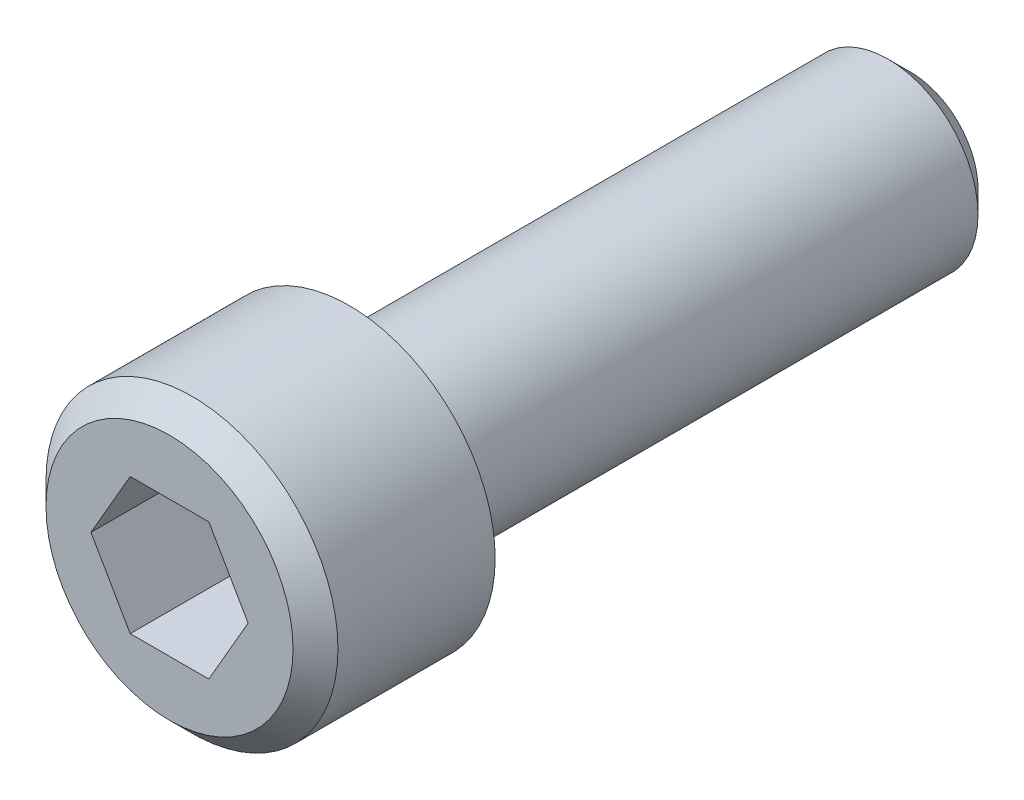
ISO-10303-21;
HEADER;
FILE_DESCRIPTION(('STEP AP214'),'2;1');
FILE_NAME('part.step','',(''),(''),'','','');
FILE_SCHEMA(('AUTOMOTIVE_DESIGN { 1 0 10303 214 1 1 1 1 }'));
ENDSEC;
DATA;
#1=APPLICATION_CONTEXT('core data for automotive mechanical design processes');
#2=APPLICATION_PROTOCOL_DEFINITION('international standard','automotive_design',2000,#1);
#3=PRODUCT_CONTEXT('',#1,'mechanical');
#4=PRODUCT('Part','Part','',(#3));
#5=PRODUCT_RELATED_PRODUCT_CATEGORY('part','',(#4));
#6=PRODUCT_DEFINITION_FORMATION('','',#4);
#7=PRODUCT_DEFINITION_CONTEXT('part definition',#1,'design');
#8=PRODUCT_DEFINITION('design','',#6,#7);
#9=PRODUCT_DEFINITION_SHAPE('','',#8);
#10=(LENGTH_UNIT() NAMED_UNIT(*) SI_UNIT(.MILLI.,.METRE.));
#11=(NAMED_UNIT(*) PLANE_ANGLE_UNIT() SI_UNIT($,.RADIAN.));
#12=(NAMED_UNIT(*) SI_UNIT($,.STERADIAN.) SOLID_ANGLE_UNIT());
#13=UNCERTAINTY_MEASURE_WITH_UNIT(LENGTH_MEASURE(1.E-05),#10,'distance_accuracy_value','');
#14=(GEOMETRIC_REPRESENTATION_CONTEXT(3) GLOBAL_UNCERTAINTY_ASSIGNED_CONTEXT((#13)) GLOBAL_UNIT_ASSIGNED_CONTEXT((#10,
#11,#12)) REPRESENTATION_CONTEXT('',''));
#15=CARTESIAN_POINT('',(0.,0.,0.));
#16=DIRECTION('',(0.,0.,1.));
#17=DIRECTION('',(1.,0.,0.));
#18=AXIS2_PLACEMENT_3D('',#15,#16,#17);
#19=CARTESIAN_POINT('',(0.,0.,0.));
#20=DIRECTION('',(0.,0.,1.));
#21=DIRECTION('',(1.,0.,0.));
#22=AXIS2_PLACEMENT_3D('',#19,#20,#21);
#23=PLANE('',#22);
#24=CARTESIAN_POINT('',(0.,0.,0.));
#25=DIRECTION('',(0.,0.,1.));
#26=DIRECTION('',(1.,0.,0.));
#27=AXIS2_PLACEMENT_3D('',#24,#25,#26);
#28=CIRCLE('',#27,6.5);
#29=CARTESIAN_POINT('',(6.5,0.,0.));
#30=VERTEX_POINT('',#29);
#31=EDGE_CURVE('E135',#30,#30,#28,.T.);
#32=ORIENTED_EDGE('',*,*,#31,.F.);
#33=EDGE_LOOP('',(#32));
#34=FACE_BOUND('',#33,.T.);
#35=CARTESIAN_POINT('',(0.,0.,0.));
#36=DIRECTION('',(0.,0.,1.));
#37=DIRECTION('',(1.,0.,0.));
#38=AXIS2_PLACEMENT_3D('',#35,#36,#37);
#39=CIRCLE('',#38,4.);
#40=CARTESIAN_POINT('',(4.,0.,0.));
#41=VERTEX_POINT('',#40);
#42=EDGE_CURVE('E143',#41,#41,#39,.F.);
#43=ORIENTED_EDGE('',*,*,#42,.F.);
#44=EDGE_LOOP('',(#43));
#45=FACE_BOUND('',#44,.T.);
#46=ADVANCED_FACE('F33',(#34,#45),#23,.F.);
#47=CARTESIAN_POINT('',(0.,0.,8.));
#48=DIRECTION('',(0.,0.,-1.));
#49=DIRECTION('',(-1.,0.,0.));
#50=AXIS2_PLACEMENT_3D('',#47,#48,#49);
#51=CYLINDRICAL_SURFACE('',#50,6.5);
#52=CARTESIAN_POINT('',(0.,0.,7.00000000000001));
#53=DIRECTION('',(0.,0.,1.));
#54=DIRECTION('',(1.,0.,0.));
#55=AXIS2_PLACEMENT_3D('',#52,#53,#54);
#56=CIRCLE('',#55,6.5);
#57=CARTESIAN_POINT('',(6.5,0.,7.00000000000001));
#58=VERTEX_POINT('',#57);
#59=EDGE_CURVE('E149',#58,#58,#56,.F.);
#60=ORIENTED_EDGE('',*,*,#59,.T.);
#61=EDGE_LOOP('',(#60));
#62=FACE_BOUND('',#61,.T.);
#63=ORIENTED_EDGE('',*,*,#31,.T.);
#64=EDGE_LOOP('',(#63));
#65=FACE_BOUND('',#64,.T.);
#66=ADVANCED_FACE('F169',(#62,#65),#51,.T.);
#67=CARTESIAN_POINT('',(0.,0.,8.));
#68=DIRECTION('',(0.,0.,1.));
#69=DIRECTION('',(1.,0.,0.));
#70=AXIS2_PLACEMENT_3D('',#67,#68,#69);
#71=PLANE('',#70);
#72=DIRECTION('',(0.5,0.866025403784439,0.));
#73=VECTOR('',#72,1.);
#74=CARTESIAN_POINT('',(1.75,-3.03108891324554,8.));
#75=LINE('',#74,#73);
#76=CARTESIAN_POINT('',(1.75,-3.03108891324554,8.));
#77=VERTEX_POINT('',#76);
#78=CARTESIAN_POINT('',(3.5,0.,8.));
#79=VERTEX_POINT('',#78);
#80=EDGE_CURVE('E48',#77,#79,#75,.T.);
#81=ORIENTED_EDGE('',*,*,#80,.F.);
#82=DIRECTION('',(1.,0.,0.));
#83=VECTOR('',#82,1.);
#84=CARTESIAN_POINT('',(-1.75,-3.03108891324554,8.));
#85=LINE('',#84,#83);
#86=CARTESIAN_POINT('',(-1.75,-3.03108891324554,8.));
#87=VERTEX_POINT('',#86);
#88=EDGE_CURVE('E131',#87,#77,#85,.T.);
#89=ORIENTED_EDGE('',*,*,#88,.F.);
#90=DIRECTION('',(0.5,-0.866025403784439,0.));
#91=VECTOR('',#90,1.);
#92=CARTESIAN_POINT('',(-3.5,0.,8.));
#93=LINE('',#92,#91);
#94=CARTESIAN_POINT('',(-3.5,0.,8.));
#95=VERTEX_POINT('',#94);
#96=EDGE_CURVE('E129',#95,#87,#93,.T.);
#97=ORIENTED_EDGE('',*,*,#96,.F.);
#98=DIRECTION('',(-0.5,-0.866025403784439,0.));
#99=VECTOR('',#98,1.);
#100=CARTESIAN_POINT('',(-1.75,3.03108891324554,8.));
#101=LINE('',#100,#99);
#102=CARTESIAN_POINT('',(-1.75,3.03108891324554,8.));
#103=VERTEX_POINT('',#102);
#104=EDGE_CURVE('E96',#103,#95,#101,.T.);
#105=ORIENTED_EDGE('',*,*,#104,.F.);
#106=DIRECTION('',(-1.,0.,0.));
#107=VECTOR('',#106,1.);
#108=CARTESIAN_POINT('',(1.75,3.03108891324554,8.));
#109=LINE('',#108,#107);
#110=CARTESIAN_POINT('',(1.75,3.03108891324554,8.));
#111=VERTEX_POINT('',#110);
#112=EDGE_CURVE('E125',#111,#103,#109,.T.);
#113=ORIENTED_EDGE('',*,*,#112,.F.);
#114=DIRECTION('',(-0.5,0.866025403784438,0.));
#115=VECTOR('',#114,1.);
#116=CARTESIAN_POINT('',(3.5,0.,8.));
#117=LINE('',#116,#115);
#118=EDGE_CURVE('E122',#79,#111,#117,.T.);
#119=ORIENTED_EDGE('',*,*,#118,.F.);
#120=EDGE_LOOP('',(#81,#89,#97,#105,#113,#119));
#121=FACE_BOUND('',#120,.T.);
#122=CARTESIAN_POINT('',(0.,0.,8.));
#123=DIRECTION('',(0.,0.,1.));
#124=DIRECTION('',(1.,0.,0.));
#125=AXIS2_PLACEMENT_3D('',#122,#123,#124);
#126=CIRCLE('',#125,5.50000000000001);
#127=CARTESIAN_POINT('',(5.50000000000001,0.,8.));
#128=VERTEX_POINT('',#127);
#129=EDGE_CURVE('E146',#128,#128,#126,.T.);
#130=ORIENTED_EDGE('',*,*,#129,.T.);
#131=EDGE_LOOP('',(#130));
#132=FACE_BOUND('',#131,.T.);
#133=ADVANCED_FACE('F175',(#121,#132),#71,.T.);
#134=CARTESIAN_POINT('',(0.,0.,-25.));
#135=DIRECTION('',(0.,0.,1.));
#136=DIRECTION('',(1.,0.,0.));
#137=AXIS2_PLACEMENT_3D('',#134,#135,#136);
#138=CYLINDRICAL_SURFACE('',#137,4.);
#139=CARTESIAN_POINT('',(0.,0.,-24.));
#140=DIRECTION('',(0.,0.,-1.));
#141=DIRECTION('',(-1.,0.,0.));
#142=AXIS2_PLACEMENT_3D('',#139,#140,#141);
#143=CIRCLE('',#142,4.);
#144=CARTESIAN_POINT('',(-4.,0.,-24.));
#145=VERTEX_POINT('',#144);
#146=EDGE_CURVE('E11',#145,#145,#143,.F.);
#147=ORIENTED_EDGE('',*,*,#146,.T.);
#148=EDGE_LOOP('',(#147));
#149=FACE_BOUND('',#148,.T.);
#150=ORIENTED_EDGE('',*,*,#42,.T.);
#151=EDGE_LOOP('',(#150));
#152=FACE_BOUND('',#151,.T.);
#153=ADVANCED_FACE('F183',(#149,#152),#138,.T.);
#154=CARTESIAN_POINT('',(0.,0.,-25.));
#155=DIRECTION('',(0.,0.,-1.));
#156=DIRECTION('',(-1.,0.,0.));
#157=AXIS2_PLACEMENT_3D('',#154,#155,#156);
#158=PLANE('',#157);
#159=CARTESIAN_POINT('',(0.,0.,-25.));
#160=DIRECTION('',(0.,0.,-1.));
#161=DIRECTION('',(-1.,0.,0.));
#162=AXIS2_PLACEMENT_3D('',#159,#160,#161);
#163=CIRCLE('',#162,3.);
#164=CARTESIAN_POINT('',(-3.,0.,-25.));
#165=VERTEX_POINT('',#164);
#166=EDGE_CURVE('E41',#165,#165,#163,.T.);
#167=ORIENTED_EDGE('',*,*,#166,.T.);
#168=EDGE_LOOP('',(#167));
#169=FACE_BOUND('',#168,.T.);
#170=ADVANCED_FACE('F154',(#169),#158,.T.);
#171=CARTESIAN_POINT('',(0.,0.,8.));
#172=DIRECTION('',(0.,0.,-1.));
#173=DIRECTION('',(-1.,0.,0.));
#174=AXIS2_PLACEMENT_3D('',#171,#172,#173);
#175=CONICAL_SURFACE('',#174,5.50000000000001,0.785398163397448);
#176=ORIENTED_EDGE('',*,*,#59,.F.);
#177=EDGE_LOOP('',(#176));
#178=FACE_BOUND('',#177,.T.);
#179=ORIENTED_EDGE('',*,*,#129,.F.);
#180=EDGE_LOOP('',(#179));
#181=FACE_BOUND('',#180,.T.);
#182=ADVANCED_FACE('F158',(#178,#181),#175,.T.);
#183=CARTESIAN_POINT('',(0.,0.,-25.));
#184=DIRECTION('',(0.,0.,1.));
#185=DIRECTION('',(1.,0.,0.));
#186=AXIS2_PLACEMENT_3D('',#183,#184,#185);
#187=CONICAL_SURFACE('',#186,3.,0.785398163397448);
#188=ORIENTED_EDGE('',*,*,#146,.F.);
#189=EDGE_LOOP('',(#188));
#190=FACE_BOUND('',#189,.T.);
#191=ORIENTED_EDGE('',*,*,#166,.F.);
#192=EDGE_LOOP('',(#191));
#193=FACE_BOUND('',#192,.T.);
#194=ADVANCED_FACE('F35',(#190,#193),#187,.T.);
#195=CARTESIAN_POINT('',(1.75,-3.03108891324554,2.));
#196=DIRECTION('',(0.866025403784439,-0.5,0.));
#197=DIRECTION('',(0.5,0.866025403784439,0.));
#198=AXIS2_PLACEMENT_3D('',#195,#196,#197);
#199=PLANE('',#198);
#200=ORIENTED_EDGE('',*,*,#80,.T.);
#201=DIRECTION('',(0.,0.,1.));
#202=VECTOR('',#201,1.);
#203=CARTESIAN_POINT('',(3.5,0.,2.));
#204=LINE('',#203,#202);
#205=CARTESIAN_POINT('',(3.5,0.,2.));
#206=VERTEX_POINT('',#205);
#207=EDGE_CURVE('E78',#206,#79,#204,.T.);
#208=ORIENTED_EDGE('',*,*,#207,.F.);
#209=DIRECTION('',(0.5,0.866025403784439,0.));
#210=VECTOR('',#209,1.);
#211=CARTESIAN_POINT('',(1.75,-3.03108891324554,2.));
#212=LINE('',#211,#210);
#213=CARTESIAN_POINT('',(1.75,-3.03108891324554,2.));
#214=VERTEX_POINT('',#213);
#215=EDGE_CURVE('E133',#214,#206,#212,.T.);
#216=ORIENTED_EDGE('',*,*,#215,.F.);
#217=DIRECTION('',(0.,0.,1.));
#218=VECTOR('',#217,1.);
#219=CARTESIAN_POINT('',(1.75,-3.03108891324554,2.));
#220=LINE('',#219,#218);
#221=EDGE_CURVE('E56',#214,#77,#220,.T.);
#222=ORIENTED_EDGE('',*,*,#221,.T.);
#223=EDGE_LOOP('',(#200,#208,#216,#222));
#224=FACE_BOUND('',#223,.T.);
#225=ADVANCED_FACE('F157',(#224),#199,.F.);
#226=CARTESIAN_POINT('',(-1.75,-3.03108891324554,2.));
#227=DIRECTION('',(0.,-1.,0.));
#228=DIRECTION('',(0.,0.,-1.));
#229=AXIS2_PLACEMENT_3D('',#226,#227,#228);
#230=PLANE('',#229);
#231=ORIENTED_EDGE('',*,*,#88,.T.);
#232=ORIENTED_EDGE('',*,*,#221,.F.);
#233=DIRECTION('',(1.,0.,0.));
#234=VECTOR('',#233,1.);
#235=CARTESIAN_POINT('',(-1.75,-3.03108891324554,2.));
#236=LINE('',#235,#234);
#237=CARTESIAN_POINT('',(-1.75,-3.03108891324554,2.));
#238=VERTEX_POINT('',#237);
#239=EDGE_CURVE('E108',#238,#214,#236,.T.);
#240=ORIENTED_EDGE('',*,*,#239,.F.);
#241=DIRECTION('',(0.,0.,1.));
#242=VECTOR('',#241,1.);
#243=CARTESIAN_POINT('',(-1.75,-3.03108891324554,2.));
#244=LINE('',#243,#242);
#245=EDGE_CURVE('E100',#238,#87,#244,.T.);
#246=ORIENTED_EDGE('',*,*,#245,.T.);
#247=EDGE_LOOP('',(#231,#232,#240,#246));
#248=FACE_BOUND('',#247,.T.);
#249=ADVANCED_FACE('F164',(#248),#230,.F.);
#250=CARTESIAN_POINT('',(-3.5,0.,2.));
#251=DIRECTION('',(-0.866025403784439,-0.5,0.));
#252=DIRECTION('',(0.5,-0.866025403784439,0.));
#253=AXIS2_PLACEMENT_3D('',#250,#251,#252);
#254=PLANE('',#253);
#255=ORIENTED_EDGE('',*,*,#96,.T.);
#256=ORIENTED_EDGE('',*,*,#245,.F.);
#257=DIRECTION('',(0.5,-0.866025403784439,0.));
#258=VECTOR('',#257,1.);
#259=CARTESIAN_POINT('',(-3.5,0.,2.));
#260=LINE('',#259,#258);
#261=CARTESIAN_POINT('',(-3.5,0.,2.));
#262=VERTEX_POINT('',#261);
#263=EDGE_CURVE('E104',#262,#238,#260,.T.);
#264=ORIENTED_EDGE('',*,*,#263,.F.);
#265=DIRECTION('',(0.,0.,1.));
#266=VECTOR('',#265,1.);
#267=CARTESIAN_POINT('',(-3.5,0.,2.));
#268=LINE('',#267,#266);
#269=EDGE_CURVE('E89',#262,#95,#268,.T.);
#270=ORIENTED_EDGE('',*,*,#269,.T.);
#271=EDGE_LOOP('',(#255,#256,#264,#270));
#272=FACE_BOUND('',#271,.T.);
#273=ADVANCED_FACE('F105',(#272),#254,.F.);
#274=CARTESIAN_POINT('',(-1.75,3.03108891324554,2.));
#275=DIRECTION('',(-0.866025403784439,0.5,0.));
#276=DIRECTION('',(-0.5,-0.866025403784439,0.));
#277=AXIS2_PLACEMENT_3D('',#274,#275,#276);
#278=PLANE('',#277);
#279=ORIENTED_EDGE('',*,*,#104,.T.);
#280=ORIENTED_EDGE('',*,*,#269,.F.);
#281=DIRECTION('',(-0.5,-0.866025403784439,0.));
#282=VECTOR('',#281,1.);
#283=CARTESIAN_POINT('',(-1.75,3.03108891324554,2.));
#284=LINE('',#283,#282);
#285=CARTESIAN_POINT('',(-1.75,3.03108891324554,2.));
#286=VERTEX_POINT('',#285);
#287=EDGE_CURVE('E93',#286,#262,#284,.T.);
#288=ORIENTED_EDGE('',*,*,#287,.F.);
#289=DIRECTION('',(0.,0.,1.));
#290=VECTOR('',#289,1.);
#291=CARTESIAN_POINT('',(-1.75,3.03108891324554,2.));
#292=LINE('',#291,#290);
#293=EDGE_CURVE('E101',#286,#103,#292,.T.);
#294=ORIENTED_EDGE('',*,*,#293,.T.);
#295=EDGE_LOOP('',(#279,#280,#288,#294));
#296=FACE_BOUND('',#295,.T.);
#297=ADVANCED_FACE('F91',(#296),#278,.F.);
#298=CARTESIAN_POINT('',(1.75,3.03108891324554,2.));
#299=DIRECTION('',(0.,1.,0.));
#300=DIRECTION('',(0.,0.,1.));
#301=AXIS2_PLACEMENT_3D('',#298,#299,#300);
#302=PLANE('',#301);
#303=ORIENTED_EDGE('',*,*,#112,.T.);
#304=ORIENTED_EDGE('',*,*,#293,.F.);
#305=DIRECTION('',(-1.,0.,0.));
#306=VECTOR('',#305,1.);
#307=CARTESIAN_POINT('',(1.75,3.03108891324554,2.));
#308=LINE('',#307,#306);
#309=CARTESIAN_POINT('',(1.75,3.03108891324554,2.));
#310=VERTEX_POINT('',#309);
#311=EDGE_CURVE('E114',#310,#286,#308,.T.);
#312=ORIENTED_EDGE('',*,*,#311,.F.);
#313=DIRECTION('',(0.,0.,1.));
#314=VECTOR('',#313,1.);
#315=CARTESIAN_POINT('',(1.75,3.03108891324554,2.));
#316=LINE('',#315,#314);
#317=EDGE_CURVE('E138',#310,#111,#316,.T.);
#318=ORIENTED_EDGE('',*,*,#317,.T.);
#319=EDGE_LOOP('',(#303,#304,#312,#318));
#320=FACE_BOUND('',#319,.T.);
#321=ADVANCED_FACE('F193',(#320),#302,.F.);
#322=CARTESIAN_POINT('',(3.5,0.,2.));
#323=DIRECTION('',(0.866025403784438,0.5,0.));
#324=DIRECTION('',(-0.5,0.866025403784439,0.));
#325=AXIS2_PLACEMENT_3D('',#322,#323,#324);
#326=PLANE('',#325);
#327=ORIENTED_EDGE('',*,*,#118,.T.);
#328=ORIENTED_EDGE('',*,*,#317,.F.);
#329=DIRECTION('',(-0.5,0.866025403784438,0.));
#330=VECTOR('',#329,1.);
#331=CARTESIAN_POINT('',(3.5,0.,2.));
#332=LINE('',#331,#330);
#333=EDGE_CURVE('E116',#206,#310,#332,.T.);
#334=ORIENTED_EDGE('',*,*,#333,.F.);
#335=ORIENTED_EDGE('',*,*,#207,.T.);
#336=EDGE_LOOP('',(#327,#328,#334,#335));
#337=FACE_BOUND('',#336,.T.);
#338=ADVANCED_FACE('F190',(#337),#326,.F.);
#339=CARTESIAN_POINT('',(0.,0.,2.));
#340=DIRECTION('',(0.,0.,1.));
#341=DIRECTION('',(1.,0.,0.));
#342=AXIS2_PLACEMENT_3D('',#339,#340,#341);
#343=PLANE('',#342);
#344=ORIENTED_EDGE('',*,*,#215,.T.);
#345=ORIENTED_EDGE('',*,*,#333,.T.);
#346=ORIENTED_EDGE('',*,*,#311,.T.);
#347=ORIENTED_EDGE('',*,*,#287,.T.);
#348=ORIENTED_EDGE('',*,*,#263,.T.);
#349=ORIENTED_EDGE('',*,*,#239,.T.);
#350=EDGE_LOOP('',(#344,#345,#346,#347,#348,#349));
#351=FACE_BOUND('',#350,.T.);
#352=ADVANCED_FACE('F111',(#351),#343,.T.);
#353=CLOSED_SHELL('',(#46,#66,#133,#153,#170,#182,#194,#225,#249,#273,#297,#321,#338,#352));
#354=MANIFOLD_SOLID_BREP('B2',#353);
#355=ADVANCED_BREP_SHAPE_REPRESENTATION('',(#18,#354),#14);
#356=SHAPE_DEFINITION_REPRESENTATION(#9,#355);
ENDSEC;
END-ISO-10303-21;
